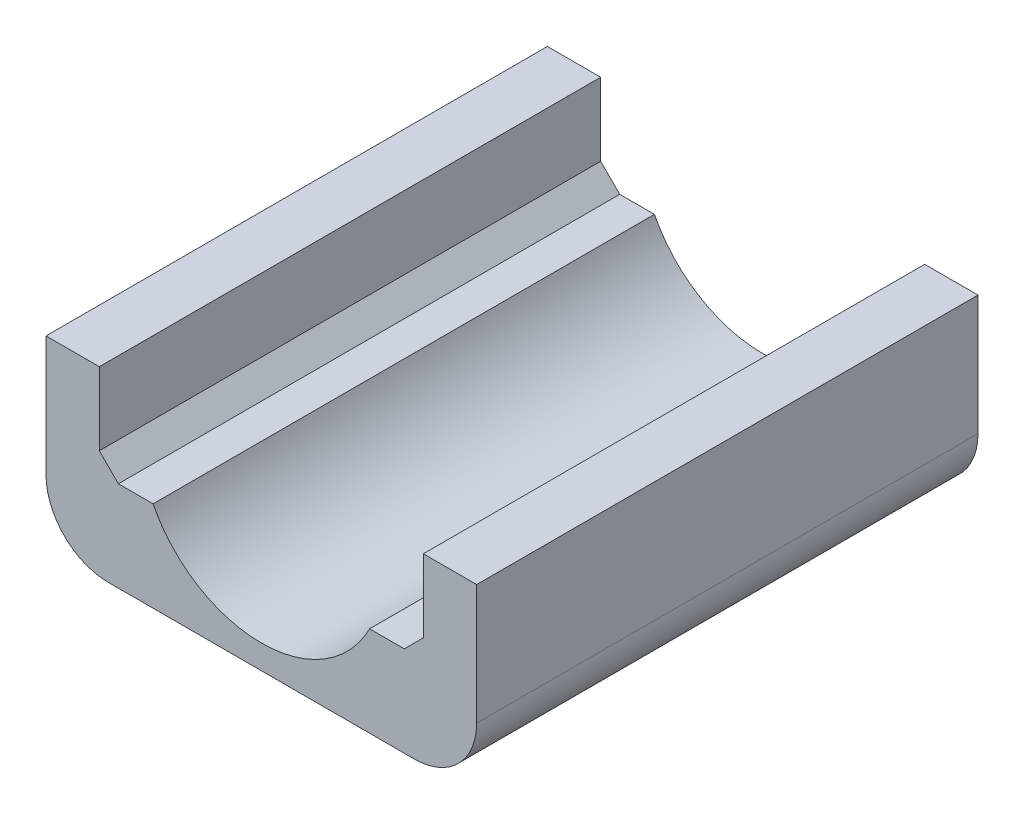
ISO-10303-21;
HEADER;
FILE_DESCRIPTION(('STEP AP214'),'2;1');
FILE_NAME('part.step','',(''),(''),'','','');
FILE_SCHEMA(('AUTOMOTIVE_DESIGN { 1 0 10303 214 1 1 1 1 }'));
ENDSEC;
DATA;
#1=APPLICATION_CONTEXT('core data for automotive mechanical design processes');
#2=APPLICATION_PROTOCOL_DEFINITION('international standard','automotive_design',2000,#1);
#3=PRODUCT_CONTEXT('',#1,'mechanical');
#4=PRODUCT('Part','Part','',(#3));
#5=PRODUCT_RELATED_PRODUCT_CATEGORY('part','',(#4));
#6=PRODUCT_DEFINITION_FORMATION('','',#4);
#7=PRODUCT_DEFINITION_CONTEXT('part definition',#1,'design');
#8=PRODUCT_DEFINITION('design','',#6,#7);
#9=PRODUCT_DEFINITION_SHAPE('','',#8);
#10=(LENGTH_UNIT() NAMED_UNIT(*) SI_UNIT(.MILLI.,.METRE.));
#11=(NAMED_UNIT(*) PLANE_ANGLE_UNIT() SI_UNIT($,.RADIAN.));
#12=(NAMED_UNIT(*) SI_UNIT($,.STERADIAN.) SOLID_ANGLE_UNIT());
#13=UNCERTAINTY_MEASURE_WITH_UNIT(LENGTH_MEASURE(1.E-05),#10,'distance_accuracy_value','');
#14=(GEOMETRIC_REPRESENTATION_CONTEXT(3) GLOBAL_UNCERTAINTY_ASSIGNED_CONTEXT((#13)) GLOBAL_UNIT_ASSIGNED_CONTEXT((#10,
#11,#12)) REPRESENTATION_CONTEXT('',''));
#15=CARTESIAN_POINT('',(0.,0.,0.));
#16=DIRECTION('',(0.,0.,1.));
#17=DIRECTION('',(1.,0.,0.));
#18=AXIS2_PLACEMENT_3D('',#15,#16,#17);
#19=CARTESIAN_POINT('',(12.0761564946184,23.3589104479386,80.5));
#20=DIRECTION('',(0.,0.,-1.));
#21=DIRECTION('',(-1.,0.,0.));
#22=AXIS2_PLACEMENT_3D('',#19,#20,#21);
#23=CYLINDRICAL_SURFACE('',#22,19.5);
#24=CARTESIAN_POINT('',(12.0761564946184,23.3589104479386,0.));
#25=DIRECTION('',(0.,0.,-1.));
#26=DIRECTION('',(1.,0.,0.));
#27=AXIS2_PLACEMENT_3D('',#24,#25,#26);
#28=CIRCLE('',#27,19.5);
#29=CARTESIAN_POINT('',(29.4569599123131,14.5182276374623,0.));
#30=VERTEX_POINT('',#29);
#31=CARTESIAN_POINT('',(-5.30464692307629,14.5182276374623,0.));
#32=VERTEX_POINT('',#31);
#33=EDGE_CURVE('E182',#30,#32,#28,.T.);
#34=ORIENTED_EDGE('',*,*,#33,.T.);
#35=DIRECTION('',(0.,0.,-1.));
#36=VECTOR('',#35,1.);
#37=CARTESIAN_POINT('',(-5.30464692307629,14.5182276374623,80.5));
#38=LINE('',#37,#36);
#39=CARTESIAN_POINT('',(-5.30464692307629,14.5182276374623,80.5));
#40=VERTEX_POINT('',#39);
#41=EDGE_CURVE('E11',#40,#32,#38,.T.);
#42=ORIENTED_EDGE('',*,*,#41,.F.);
#43=CARTESIAN_POINT('',(12.0761564946184,23.3589104479386,80.5));
#44=DIRECTION('',(0.,0.,-1.));
#45=DIRECTION('',(1.,0.,0.));
#46=AXIS2_PLACEMENT_3D('',#43,#44,#45);
#47=CIRCLE('',#46,19.5);
#48=CARTESIAN_POINT('',(29.4569599123131,14.5182276374623,80.5));
#49=VERTEX_POINT('',#48);
#50=EDGE_CURVE('E222',#49,#40,#47,.T.);
#51=ORIENTED_EDGE('',*,*,#50,.F.);
#52=DIRECTION('',(0.,0.,-1.));
#53=VECTOR('',#52,1.);
#54=CARTESIAN_POINT('',(29.4569599123131,14.5182276374623,80.5));
#55=LINE('',#54,#53);
#56=EDGE_CURVE('E178',#49,#30,#55,.T.);
#57=ORIENTED_EDGE('',*,*,#56,.T.);
#58=EDGE_LOOP('',(#34,#42,#51,#57));
#59=FACE_BOUND('',#58,.T.);
#60=ADVANCED_FACE('F45',(#59),#23,.F.);
#61=CARTESIAN_POINT('',(-10.8746469230763,14.5182276374622,80.5));
#62=DIRECTION('',(0.,-1.,0.));
#63=DIRECTION('',(1.,0.,0.));
#64=AXIS2_PLACEMENT_3D('',#61,#62,#63);
#65=PLANE('',#64);
#66=DIRECTION('',(-1.,0.,0.));
#67=VECTOR('',#66,1.);
#68=CARTESIAN_POINT('',(-10.8746469230763,14.5182276374622,0.));
#69=LINE('',#68,#67);
#70=CARTESIAN_POINT('',(-10.8746469230763,14.5182276374622,0.));
#71=VERTEX_POINT('',#70);
#72=EDGE_CURVE('E186',#32,#71,#69,.T.);
#73=ORIENTED_EDGE('',*,*,#72,.T.);
#74=DIRECTION('',(0.,0.,-1.));
#75=VECTOR('',#74,1.);
#76=CARTESIAN_POINT('',(-10.8746469230763,14.5182276374622,80.5));
#77=LINE('',#76,#75);
#78=CARTESIAN_POINT('',(-10.8746469230763,14.5182276374622,80.5));
#79=VERTEX_POINT('',#78);
#80=EDGE_CURVE('E54',#79,#71,#77,.T.);
#81=ORIENTED_EDGE('',*,*,#80,.F.);
#82=DIRECTION('',(-1.,0.,0.));
#83=VECTOR('',#82,1.);
#84=CARTESIAN_POINT('',(-10.8746469230763,14.5182276374622,80.5));
#85=LINE('',#84,#83);
#86=EDGE_CURVE('E123',#40,#79,#85,.T.);
#87=ORIENTED_EDGE('',*,*,#86,.F.);
#88=ORIENTED_EDGE('',*,*,#41,.T.);
#89=EDGE_LOOP('',(#73,#81,#87,#88));
#90=FACE_BOUND('',#89,.T.);
#91=ADVANCED_FACE('F330',(#90),#65,.F.);
#92=CARTESIAN_POINT('',(-13.936419285614,17.58,80.5));
#93=DIRECTION('',(-0.707106781186547,-0.707106781186547,0.));
#94=DIRECTION('',(0.707106781186548,-0.707106781186548,0.));
#95=AXIS2_PLACEMENT_3D('',#92,#93,#94);
#96=PLANE('',#95);
#97=DIRECTION('',(-0.707106781186548,0.707106781186548,0.));
#98=VECTOR('',#97,1.);
#99=CARTESIAN_POINT('',(-13.936419285614,17.58,0.));
#100=LINE('',#99,#98);
#101=CARTESIAN_POINT('',(-13.936419285614,17.58,0.));
#102=VERTEX_POINT('',#101);
#103=EDGE_CURVE('E189',#71,#102,#100,.T.);
#104=ORIENTED_EDGE('',*,*,#103,.T.);
#105=DIRECTION('',(0.,0.,-1.));
#106=VECTOR('',#105,1.);
#107=CARTESIAN_POINT('',(-13.936419285614,17.58,80.5));
#108=LINE('',#107,#106);
#109=CARTESIAN_POINT('',(-13.936419285614,17.58,80.5));
#110=VERTEX_POINT('',#109);
#111=EDGE_CURVE('E257',#110,#102,#108,.T.);
#112=ORIENTED_EDGE('',*,*,#111,.F.);
#113=DIRECTION('',(-0.707106781186548,0.707106781186548,0.));
#114=VECTOR('',#113,1.);
#115=CARTESIAN_POINT('',(-13.936419285614,17.58,80.5));
#116=LINE('',#115,#114);
#117=EDGE_CURVE('E267',#79,#110,#116,.T.);
#118=ORIENTED_EDGE('',*,*,#117,.F.);
#119=ORIENTED_EDGE('',*,*,#80,.T.);
#120=EDGE_LOOP('',(#104,#112,#118,#119));
#121=FACE_BOUND('',#120,.T.);
#122=ADVANCED_FACE('F265',(#121),#96,.F.);
#123=CARTESIAN_POINT('',(-13.936419285614,29.27,80.5));
#124=DIRECTION('',(-1.,0.,0.));
#125=DIRECTION('',(0.,0.,1.));
#126=AXIS2_PLACEMENT_3D('',#123,#124,#125);
#127=PLANE('',#126);
#128=DIRECTION('',(0.,1.,0.));
#129=VECTOR('',#128,1.);
#130=CARTESIAN_POINT('',(-13.936419285614,29.27,0.));
#131=LINE('',#130,#129);
#132=CARTESIAN_POINT('',(-13.936419285614,29.27,0.));
#133=VERTEX_POINT('',#132);
#134=EDGE_CURVE('E192',#102,#133,#131,.T.);
#135=ORIENTED_EDGE('',*,*,#134,.T.);
#136=DIRECTION('',(0.,0.,-1.));
#137=VECTOR('',#136,1.);
#138=CARTESIAN_POINT('',(-13.936419285614,29.27,80.5));
#139=LINE('',#138,#137);
#140=CARTESIAN_POINT('',(-13.936419285614,29.27,80.5));
#141=VERTEX_POINT('',#140);
#142=EDGE_CURVE('E253',#141,#133,#139,.T.);
#143=ORIENTED_EDGE('',*,*,#142,.F.);
#144=DIRECTION('',(0.,1.,0.));
#145=VECTOR('',#144,1.);
#146=CARTESIAN_POINT('',(-13.936419285614,29.27,80.5));
#147=LINE('',#146,#145);
#148=EDGE_CURVE('E286',#110,#141,#147,.T.);
#149=ORIENTED_EDGE('',*,*,#148,.F.);
#150=ORIENTED_EDGE('',*,*,#111,.T.);
#151=EDGE_LOOP('',(#135,#143,#149,#150));
#152=FACE_BOUND('',#151,.T.);
#153=ADVANCED_FACE('F276',(#152),#127,.F.);
#154=CARTESIAN_POINT('',(-22.496419285614,29.27,80.5));
#155=DIRECTION('',(0.,-1.,0.));
#156=DIRECTION('',(1.,0.,0.));
#157=AXIS2_PLACEMENT_3D('',#154,#155,#156);
#158=PLANE('',#157);
#159=DIRECTION('',(-1.,0.,0.));
#160=VECTOR('',#159,1.);
#161=CARTESIAN_POINT('',(-22.496419285614,29.27,0.));
#162=LINE('',#161,#160);
#163=CARTESIAN_POINT('',(-22.496419285614,29.27,0.));
#164=VERTEX_POINT('',#163);
#165=EDGE_CURVE('E195',#133,#164,#162,.T.);
#166=ORIENTED_EDGE('',*,*,#165,.T.);
#167=DIRECTION('',(0.,0.,-1.));
#168=VECTOR('',#167,1.);
#169=CARTESIAN_POINT('',(-22.496419285614,29.27,80.5));
#170=LINE('',#169,#168);
#171=CARTESIAN_POINT('',(-22.496419285614,29.27,80.5));
#172=VERTEX_POINT('',#171);
#173=EDGE_CURVE('E249',#172,#164,#170,.T.);
#174=ORIENTED_EDGE('',*,*,#173,.F.);
#175=DIRECTION('',(-1.,0.,0.));
#176=VECTOR('',#175,1.);
#177=CARTESIAN_POINT('',(-22.496419285614,29.27,80.5));
#178=LINE('',#177,#176);
#179=EDGE_CURVE('E282',#141,#172,#178,.T.);
#180=ORIENTED_EDGE('',*,*,#179,.F.);
#181=ORIENTED_EDGE('',*,*,#142,.T.);
#182=EDGE_LOOP('',(#166,#174,#180,#181));
#183=FACE_BOUND('',#182,.T.);
#184=ADVANCED_FACE('F280',(#183),#158,.F.);
#185=CARTESIAN_POINT('',(-22.496419285614,29.27,80.5));
#186=DIRECTION('',(1.,0.,0.));
#187=DIRECTION('',(0.,0.,-1.));
#188=AXIS2_PLACEMENT_3D('',#185,#186,#187);
#189=PLANE('',#188);
#190=DIRECTION('',(0.,-1.,0.));
#191=VECTOR('',#190,1.);
#192=CARTESIAN_POINT('',(-22.496419285614,29.27,0.));
#193=LINE('',#192,#191);
#194=CARTESIAN_POINT('',(-22.496419285614,10.,0.));
#195=VERTEX_POINT('',#194);
#196=EDGE_CURVE('E198',#164,#195,#193,.T.);
#197=ORIENTED_EDGE('',*,*,#196,.T.);
#198=DIRECTION('',(0.,0.,-1.));
#199=VECTOR('',#198,1.);
#200=CARTESIAN_POINT('',(-22.496419285614,10.,80.5));
#201=LINE('',#200,#199);
#202=CARTESIAN_POINT('',(-22.496419285614,10.,80.5));
#203=VERTEX_POINT('',#202);
#204=EDGE_CURVE('E245',#203,#195,#201,.T.);
#205=ORIENTED_EDGE('',*,*,#204,.F.);
#206=DIRECTION('',(0.,-1.,0.));
#207=VECTOR('',#206,1.);
#208=CARTESIAN_POINT('',(-22.496419285614,29.27,80.5));
#209=LINE('',#208,#207);
#210=EDGE_CURVE('E285',#172,#203,#209,.T.);
#211=ORIENTED_EDGE('',*,*,#210,.F.);
#212=ORIENTED_EDGE('',*,*,#173,.T.);
#213=EDGE_LOOP('',(#197,#205,#211,#212));
#214=FACE_BOUND('',#213,.T.);
#215=ADVANCED_FACE('F343',(#214),#189,.F.);
#216=CARTESIAN_POINT('',(-12.496419285614,10.,80.5));
#217=DIRECTION('',(0.,0.,-1.));
#218=DIRECTION('',(-1.,0.,0.));
#219=AXIS2_PLACEMENT_3D('',#216,#217,#218);
#220=CYLINDRICAL_SURFACE('',#219,10.);
#221=CARTESIAN_POINT('',(-12.496419285614,10.,0.));
#222=DIRECTION('',(0.,0.,1.));
#223=DIRECTION('',(-1.,0.,0.));
#224=AXIS2_PLACEMENT_3D('',#221,#222,#223);
#225=CIRCLE('',#224,10.);
#226=CARTESIAN_POINT('',(-12.496419285614,0.,0.));
#227=VERTEX_POINT('',#226);
#228=EDGE_CURVE('E201',#195,#227,#225,.T.);
#229=ORIENTED_EDGE('',*,*,#228,.T.);
#230=DIRECTION('',(0.,0.,-1.));
#231=VECTOR('',#230,1.);
#232=CARTESIAN_POINT('',(-12.496419285614,0.,80.5));
#233=LINE('',#232,#231);
#234=CARTESIAN_POINT('',(-12.496419285614,0.,80.5));
#235=VERTEX_POINT('',#234);
#236=EDGE_CURVE('E241',#235,#227,#233,.T.);
#237=ORIENTED_EDGE('',*,*,#236,.F.);
#238=CARTESIAN_POINT('',(-12.496419285614,10.,80.5));
#239=DIRECTION('',(0.,0.,1.));
#240=DIRECTION('',(-1.,0.,0.));
#241=AXIS2_PLACEMENT_3D('',#238,#239,#240);
#242=CIRCLE('',#241,10.);
#243=EDGE_CURVE('E290',#203,#235,#242,.T.);
#244=ORIENTED_EDGE('',*,*,#243,.F.);
#245=ORIENTED_EDGE('',*,*,#204,.T.);
#246=EDGE_LOOP('',(#229,#237,#244,#245));
#247=FACE_BOUND('',#246,.T.);
#248=ADVANCED_FACE('F346',(#247),#220,.T.);
#249=CARTESIAN_POINT('',(-12.496419285614,0.,80.5));
#250=DIRECTION('',(0.,1.,0.));
#251=DIRECTION('',(0.,0.,1.));
#252=AXIS2_PLACEMENT_3D('',#249,#250,#251);
#253=PLANE('',#252);
#254=DIRECTION('',(1.,0.,0.));
#255=VECTOR('',#254,1.);
#256=CARTESIAN_POINT('',(-12.496419285614,0.,0.));
#257=LINE('',#256,#255);
#258=CARTESIAN_POINT('',(36.6487322748508,0.,0.));
#259=VERTEX_POINT('',#258);
#260=EDGE_CURVE('E204',#227,#259,#257,.T.);
#261=ORIENTED_EDGE('',*,*,#260,.T.);
#262=DIRECTION('',(0.,0.,-1.));
#263=VECTOR('',#262,1.);
#264=CARTESIAN_POINT('',(36.6487322748508,0.,80.5));
#265=LINE('',#264,#263);
#266=CARTESIAN_POINT('',(36.6487322748508,0.,80.5));
#267=VERTEX_POINT('',#266);
#268=EDGE_CURVE('E237',#267,#259,#265,.T.);
#269=ORIENTED_EDGE('',*,*,#268,.F.);
#270=DIRECTION('',(1.,0.,0.));
#271=VECTOR('',#270,1.);
#272=CARTESIAN_POINT('',(-12.496419285614,0.,80.5));
#273=LINE('',#272,#271);
#274=EDGE_CURVE('E297',#235,#267,#273,.T.);
#275=ORIENTED_EDGE('',*,*,#274,.F.);
#276=ORIENTED_EDGE('',*,*,#236,.T.);
#277=EDGE_LOOP('',(#261,#269,#275,#276));
#278=FACE_BOUND('',#277,.T.);
#279=ADVANCED_FACE('F350',(#278),#253,.F.);
#280=CARTESIAN_POINT('',(36.6487322748509,10.,80.5));
#281=DIRECTION('',(0.,0.,-1.));
#282=DIRECTION('',(-1.,0.,0.));
#283=AXIS2_PLACEMENT_3D('',#280,#281,#282);
#284=CYLINDRICAL_SURFACE('',#283,10.);
#285=CARTESIAN_POINT('',(36.6487322748509,10.,0.));
#286=DIRECTION('',(0.,0.,1.));
#287=DIRECTION('',(1.,0.,0.));
#288=AXIS2_PLACEMENT_3D('',#285,#286,#287);
#289=CIRCLE('',#288,10.);
#290=CARTESIAN_POINT('',(46.6487322748509,10.0000000000001,0.));
#291=VERTEX_POINT('',#290);
#292=EDGE_CURVE('E207',#259,#291,#289,.T.);
#293=ORIENTED_EDGE('',*,*,#292,.T.);
#294=DIRECTION('',(0.,0.,-1.));
#295=VECTOR('',#294,1.);
#296=CARTESIAN_POINT('',(46.6487322748509,10.0000000000001,80.5));
#297=LINE('',#296,#295);
#298=CARTESIAN_POINT('',(46.6487322748509,10.0000000000001,80.5));
#299=VERTEX_POINT('',#298);
#300=EDGE_CURVE('E233',#299,#291,#297,.T.);
#301=ORIENTED_EDGE('',*,*,#300,.F.);
#302=CARTESIAN_POINT('',(36.6487322748509,10.,80.5));
#303=DIRECTION('',(0.,0.,1.));
#304=DIRECTION('',(1.,0.,0.));
#305=AXIS2_PLACEMENT_3D('',#302,#303,#304);
#306=CIRCLE('',#305,10.);
#307=EDGE_CURVE('E300',#267,#299,#306,.T.);
#308=ORIENTED_EDGE('',*,*,#307,.F.);
#309=ORIENTED_EDGE('',*,*,#268,.T.);
#310=EDGE_LOOP('',(#293,#301,#308,#309));
#311=FACE_BOUND('',#310,.T.);
#312=ADVANCED_FACE('F354',(#311),#284,.T.);
#313=CARTESIAN_POINT('',(46.6487322748509,29.27,80.5));
#314=DIRECTION('',(-1.,0.,0.));
#315=DIRECTION('',(0.,0.,1.));
#316=AXIS2_PLACEMENT_3D('',#313,#314,#315);
#317=PLANE('',#316);
#318=DIRECTION('',(0.,1.,0.));
#319=VECTOR('',#318,1.);
#320=CARTESIAN_POINT('',(46.6487322748509,29.27,0.));
#321=LINE('',#320,#319);
#322=CARTESIAN_POINT('',(46.6487322748509,29.27,0.));
#323=VERTEX_POINT('',#322);
#324=EDGE_CURVE('E210',#291,#323,#321,.T.);
#325=ORIENTED_EDGE('',*,*,#324,.T.);
#326=DIRECTION('',(0.,0.,-1.));
#327=VECTOR('',#326,1.);
#328=CARTESIAN_POINT('',(46.6487322748509,29.27,80.5));
#329=LINE('',#328,#327);
#330=CARTESIAN_POINT('',(46.6487322748509,29.27,80.5));
#331=VERTEX_POINT('',#330);
#332=EDGE_CURVE('E229',#331,#323,#329,.T.);
#333=ORIENTED_EDGE('',*,*,#332,.F.);
#334=DIRECTION('',(0.,1.,0.));
#335=VECTOR('',#334,1.);
#336=CARTESIAN_POINT('',(46.6487322748509,29.27,80.5));
#337=LINE('',#336,#335);
#338=EDGE_CURVE('E303',#299,#331,#337,.T.);
#339=ORIENTED_EDGE('',*,*,#338,.F.);
#340=ORIENTED_EDGE('',*,*,#300,.T.);
#341=EDGE_LOOP('',(#325,#333,#339,#340));
#342=FACE_BOUND('',#341,.T.);
#343=ADVANCED_FACE('F311',(#342),#317,.F.);
#344=CARTESIAN_POINT('',(46.6487322748509,29.27,80.5));
#345=DIRECTION('',(0.,-1.,0.));
#346=DIRECTION('',(1.,0.,0.));
#347=AXIS2_PLACEMENT_3D('',#344,#345,#346);
#348=PLANE('',#347);
#349=DIRECTION('',(-1.,0.,0.));
#350=VECTOR('',#349,1.);
#351=CARTESIAN_POINT('',(46.6487322748509,29.27,0.));
#352=LINE('',#351,#350);
#353=CARTESIAN_POINT('',(38.0887322748509,29.27,0.));
#354=VERTEX_POINT('',#353);
#355=EDGE_CURVE('E213',#323,#354,#352,.T.);
#356=ORIENTED_EDGE('',*,*,#355,.T.);
#357=DIRECTION('',(0.,0.,-1.));
#358=VECTOR('',#357,1.);
#359=CARTESIAN_POINT('',(38.0887322748509,29.27,80.5));
#360=LINE('',#359,#358);
#361=CARTESIAN_POINT('',(38.0887322748509,29.27,80.5));
#362=VERTEX_POINT('',#361);
#363=EDGE_CURVE('E171',#362,#354,#360,.T.);
#364=ORIENTED_EDGE('',*,*,#363,.F.);
#365=DIRECTION('',(-1.,0.,0.));
#366=VECTOR('',#365,1.);
#367=CARTESIAN_POINT('',(46.6487322748509,29.27,80.5));
#368=LINE('',#367,#366);
#369=EDGE_CURVE('E160',#331,#362,#368,.T.);
#370=ORIENTED_EDGE('',*,*,#369,.F.);
#371=ORIENTED_EDGE('',*,*,#332,.T.);
#372=EDGE_LOOP('',(#356,#364,#370,#371));
#373=FACE_BOUND('',#372,.T.);
#374=ADVANCED_FACE('F315',(#373),#348,.F.);
#375=CARTESIAN_POINT('',(38.0887322748509,29.27,80.5));
#376=DIRECTION('',(1.,0.,0.));
#377=DIRECTION('',(0.,0.,-1.));
#378=AXIS2_PLACEMENT_3D('',#375,#376,#377);
#379=PLANE('',#378);
#380=DIRECTION('',(0.,-1.,0.));
#381=VECTOR('',#380,1.);
#382=CARTESIAN_POINT('',(38.0887322748509,29.27,0.));
#383=LINE('',#382,#381);
#384=CARTESIAN_POINT('',(38.0887322748509,17.58,0.));
#385=VERTEX_POINT('',#384);
#386=EDGE_CURVE('E169',#354,#385,#383,.T.);
#387=ORIENTED_EDGE('',*,*,#386,.T.);
#388=DIRECTION('',(0.,0.,-1.));
#389=VECTOR('',#388,1.);
#390=CARTESIAN_POINT('',(38.0887322748509,17.58,80.5));
#391=LINE('',#390,#389);
#392=CARTESIAN_POINT('',(38.0887322748509,17.58,80.5));
#393=VERTEX_POINT('',#392);
#394=EDGE_CURVE('E166',#393,#385,#391,.T.);
#395=ORIENTED_EDGE('',*,*,#394,.F.);
#396=DIRECTION('',(0.,-1.,0.));
#397=VECTOR('',#396,1.);
#398=CARTESIAN_POINT('',(38.0887322748509,29.27,80.5));
#399=LINE('',#398,#397);
#400=EDGE_CURVE('E154',#362,#393,#399,.T.);
#401=ORIENTED_EDGE('',*,*,#400,.F.);
#402=ORIENTED_EDGE('',*,*,#363,.T.);
#403=EDGE_LOOP('',(#387,#395,#401,#402));
#404=FACE_BOUND('',#403,.T.);
#405=ADVANCED_FACE('F167',(#404),#379,.F.);
#406=CARTESIAN_POINT('',(38.0887322748509,17.58,80.5));
#407=DIRECTION('',(0.707106781186546,-0.707106781186549,0.));
#408=DIRECTION('',(0.707106781186549,0.707106781186546,0.));
#409=AXIS2_PLACEMENT_3D('',#406,#407,#408);
#410=PLANE('',#409);
#411=DIRECTION('',(-0.707106781186549,-0.707106781186546,0.));
#412=VECTOR('',#411,1.);
#413=CARTESIAN_POINT('',(38.0887322748509,17.58,0.));
#414=LINE('',#413,#412);
#415=CARTESIAN_POINT('',(35.0269599123132,14.5182276374622,0.));
#416=VERTEX_POINT('',#415);
#417=EDGE_CURVE('E109',#385,#416,#414,.T.);
#418=ORIENTED_EDGE('',*,*,#417,.T.);
#419=DIRECTION('',(0.,0.,-1.));
#420=VECTOR('',#419,1.);
#421=CARTESIAN_POINT('',(35.0269599123132,14.5182276374622,80.5));
#422=LINE('',#421,#420);
#423=CARTESIAN_POINT('',(35.0269599123132,14.5182276374622,80.5));
#424=VERTEX_POINT('',#423);
#425=EDGE_CURVE('E172',#424,#416,#422,.T.);
#426=ORIENTED_EDGE('',*,*,#425,.F.);
#427=DIRECTION('',(-0.707106781186549,-0.707106781186546,0.));
#428=VECTOR('',#427,1.);
#429=CARTESIAN_POINT('',(38.0887322748509,17.58,80.5));
#430=LINE('',#429,#428);
#431=EDGE_CURVE('E158',#393,#424,#430,.T.);
#432=ORIENTED_EDGE('',*,*,#431,.F.);
#433=ORIENTED_EDGE('',*,*,#394,.T.);
#434=EDGE_LOOP('',(#418,#426,#432,#433));
#435=FACE_BOUND('',#434,.T.);
#436=ADVANCED_FACE('F174',(#435),#410,.F.);
#437=CARTESIAN_POINT('',(35.0269599123132,14.5182276374622,80.5));
#438=DIRECTION('',(0.,-1.,0.));
#439=DIRECTION('',(1.,0.,0.));
#440=AXIS2_PLACEMENT_3D('',#437,#438,#439);
#441=PLANE('',#440);
#442=DIRECTION('',(-1.,0.,0.));
#443=VECTOR('',#442,1.);
#444=CARTESIAN_POINT('',(35.0269599123132,14.5182276374622,0.));
#445=LINE('',#444,#443);
#446=EDGE_CURVE('E115',#416,#30,#445,.T.);
#447=ORIENTED_EDGE('',*,*,#446,.T.);
#448=ORIENTED_EDGE('',*,*,#56,.F.);
#449=DIRECTION('',(-1.,0.,0.));
#450=VECTOR('',#449,1.);
#451=CARTESIAN_POINT('',(35.0269599123132,14.5182276374622,80.5));
#452=LINE('',#451,#450);
#453=EDGE_CURVE('E62',#424,#49,#452,.T.);
#454=ORIENTED_EDGE('',*,*,#453,.F.);
#455=ORIENTED_EDGE('',*,*,#425,.T.);
#456=EDGE_LOOP('',(#447,#448,#454,#455));
#457=FACE_BOUND('',#456,.T.);
#458=ADVANCED_FACE('F319',(#457),#441,.F.);
#459=CARTESIAN_POINT('',(12.0761564946184,23.3589104479386,80.5));
#460=DIRECTION('',(0.,0.,1.));
#461=DIRECTION('',(1.,0.,0.));
#462=AXIS2_PLACEMENT_3D('',#459,#460,#461);
#463=PLANE('',#462);
#464=ORIENTED_EDGE('',*,*,#50,.T.);
#465=ORIENTED_EDGE('',*,*,#86,.T.);
#466=ORIENTED_EDGE('',*,*,#117,.T.);
#467=ORIENTED_EDGE('',*,*,#148,.T.);
#468=ORIENTED_EDGE('',*,*,#179,.T.);
#469=ORIENTED_EDGE('',*,*,#210,.T.);
#470=ORIENTED_EDGE('',*,*,#243,.T.);
#471=ORIENTED_EDGE('',*,*,#274,.T.);
#472=ORIENTED_EDGE('',*,*,#307,.T.);
#473=ORIENTED_EDGE('',*,*,#338,.T.);
#474=ORIENTED_EDGE('',*,*,#369,.T.);
#475=ORIENTED_EDGE('',*,*,#400,.T.);
#476=ORIENTED_EDGE('',*,*,#431,.T.);
#477=ORIENTED_EDGE('',*,*,#453,.T.);
#478=EDGE_LOOP('',(#464,#465,#466,#467,#468,#469,#470,#471,#472,#473,#474,#475,#476,#477));
#479=FACE_BOUND('',#478,.T.);
#480=ADVANCED_FACE('F156',(#479),#463,.T.);
#481=CARTESIAN_POINT('',(12.0761564946184,23.3589104479386,0.));
#482=DIRECTION('',(0.,0.,1.));
#483=DIRECTION('',(1.,0.,0.));
#484=AXIS2_PLACEMENT_3D('',#481,#482,#483);
#485=PLANE('',#484);
#486=ORIENTED_EDGE('',*,*,#33,.F.);
#487=ORIENTED_EDGE('',*,*,#446,.F.);
#488=ORIENTED_EDGE('',*,*,#417,.F.);
#489=ORIENTED_EDGE('',*,*,#386,.F.);
#490=ORIENTED_EDGE('',*,*,#355,.F.);
#491=ORIENTED_EDGE('',*,*,#324,.F.);
#492=ORIENTED_EDGE('',*,*,#292,.F.);
#493=ORIENTED_EDGE('',*,*,#260,.F.);
#494=ORIENTED_EDGE('',*,*,#228,.F.);
#495=ORIENTED_EDGE('',*,*,#196,.F.);
#496=ORIENTED_EDGE('',*,*,#165,.F.);
#497=ORIENTED_EDGE('',*,*,#134,.F.);
#498=ORIENTED_EDGE('',*,*,#103,.F.);
#499=ORIENTED_EDGE('',*,*,#72,.F.);
#500=EDGE_LOOP('',(#486,#487,#488,#489,#490,#491,#492,#493,#494,#495,#496,#497,#498,#499));
#501=FACE_BOUND('',#500,.T.);
#502=ADVANCED_FACE('F271',(#501),#485,.F.);
#503=CLOSED_SHELL('',(#60,#91,#122,#153,#184,#215,#248,#279,#312,#343,#374,#405,#436,#458,#480,#502));
#504=MANIFOLD_SOLID_BREP('B2',#503);
#505=ADVANCED_BREP_SHAPE_REPRESENTATION('',(#18,#504),#14);
#506=SHAPE_DEFINITION_REPRESENTATION(#9,#505);
ENDSEC;
END-ISO-10303-21;
